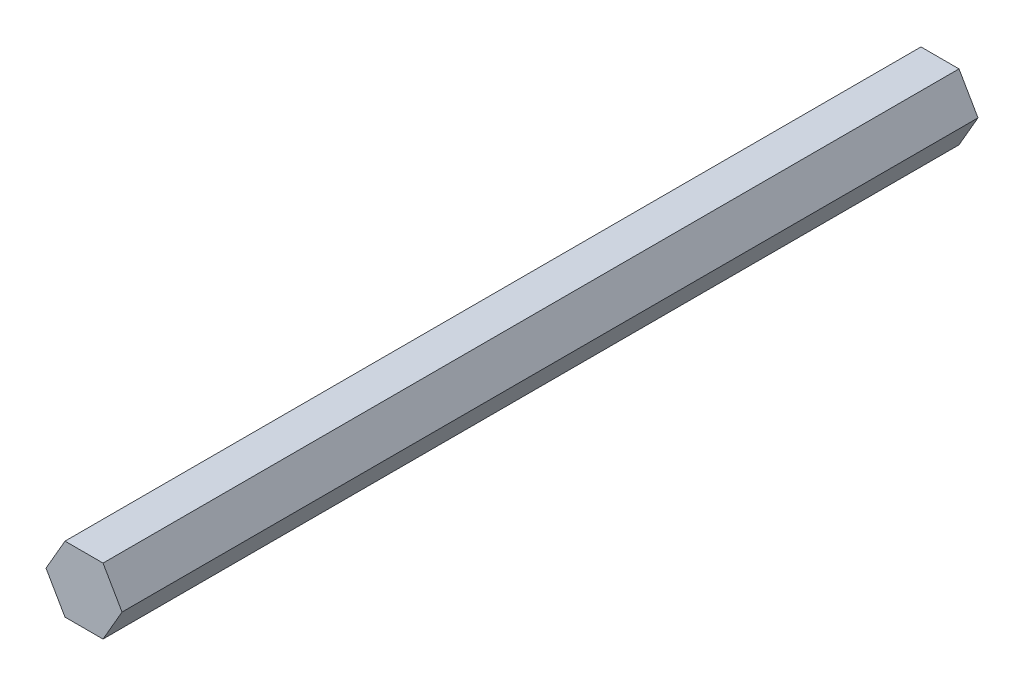
ISO-10303-21;
HEADER;
FILE_DESCRIPTION(('STEP AP214'),'2;1');
FILE_NAME('part.step','',(''),(''),'','','');
FILE_SCHEMA(('AUTOMOTIVE_DESIGN { 1 0 10303 214 1 1 1 1 }'));
ENDSEC;
DATA;
#1=APPLICATION_CONTEXT('core data for automotive mechanical design processes');
#2=APPLICATION_PROTOCOL_DEFINITION('international standard','automotive_design',2000,#1);
#3=PRODUCT_CONTEXT('',#1,'mechanical');
#4=PRODUCT('Part','Part','',(#3));
#5=PRODUCT_RELATED_PRODUCT_CATEGORY('part','',(#4));
#6=PRODUCT_DEFINITION_FORMATION('','',#4);
#7=PRODUCT_DEFINITION_CONTEXT('part definition',#1,'design');
#8=PRODUCT_DEFINITION('design','',#6,#7);
#9=PRODUCT_DEFINITION_SHAPE('','',#8);
#10=(LENGTH_UNIT() NAMED_UNIT(*) SI_UNIT(.MILLI.,.METRE.));
#11=(NAMED_UNIT(*) PLANE_ANGLE_UNIT() SI_UNIT($,.RADIAN.));
#12=(NAMED_UNIT(*) SI_UNIT($,.STERADIAN.) SOLID_ANGLE_UNIT());
#13=UNCERTAINTY_MEASURE_WITH_UNIT(LENGTH_MEASURE(1.E-05),#10,'distance_accuracy_value','');
#14=(GEOMETRIC_REPRESENTATION_CONTEXT(3) GLOBAL_UNCERTAINTY_ASSIGNED_CONTEXT((#13)) GLOBAL_UNIT_ASSIGNED_CONTEXT((#10,
#11,#12)) REPRESENTATION_CONTEXT('',''));
#15=CARTESIAN_POINT('',(0.,0.,0.));
#16=DIRECTION('',(0.,0.,1.));
#17=DIRECTION('',(1.,0.,0.));
#18=AXIS2_PLACEMENT_3D('',#15,#16,#17);
#19=CARTESIAN_POINT('',(-3.66879836416926,-6.34848422037909,165.1));
#20=DIRECTION('',(0.000413302037869118,0.999999914590709,0.));
#21=DIRECTION('',(-0.999999914590709,0.000413302037869118,0.));
#22=AXIS2_PLACEMENT_3D('',#19,#20,#21);
#23=PLANE('',#22);
#24=DIRECTION('',(0.999999914590709,-0.000413302037869118,0.));
#25=VECTOR('',#24,1.);
#26=CARTESIAN_POINT('',(-3.66879836416926,-6.34848422037909,0.));
#27=LINE('',#26,#25);
#28=CARTESIAN_POINT('',(-3.66879836416926,-6.34848422037909,0.));
#29=VERTEX_POINT('',#28);
#30=CARTESIAN_POINT('',(3.66354942828831,-6.35151469492291,0.));
#31=VERTEX_POINT('',#30);
#32=EDGE_CURVE('E120',#29,#31,#27,.T.);
#33=ORIENTED_EDGE('',*,*,#32,.T.);
#34=DIRECTION('',(0.,0.,-1.));
#35=VECTOR('',#34,1.);
#36=CARTESIAN_POINT('',(3.66354942828831,-6.35151469492291,165.1));
#37=LINE('',#36,#35);
#38=CARTESIAN_POINT('',(3.66354942828831,-6.35151469492291,165.1));
#39=VERTEX_POINT('',#38);
#40=EDGE_CURVE('E11',#39,#31,#37,.T.);
#41=ORIENTED_EDGE('',*,*,#40,.F.);
#42=DIRECTION('',(0.999999914590709,-0.000413302037869118,0.));
#43=VECTOR('',#42,1.);
#44=CARTESIAN_POINT('',(-3.66879836416926,-6.34848422037909,165.1));
#45=LINE('',#44,#43);
#46=CARTESIAN_POINT('',(-3.66879836416926,-6.34848422037909,165.1));
#47=VERTEX_POINT('',#46);
#48=EDGE_CURVE('E130',#47,#39,#45,.T.);
#49=ORIENTED_EDGE('',*,*,#48,.F.);
#50=DIRECTION('',(0.,0.,-1.));
#51=VECTOR('',#50,1.);
#52=CARTESIAN_POINT('',(-3.66879836416926,-6.34848422037909,165.1));
#53=LINE('',#52,#51);
#54=EDGE_CURVE('E116',#47,#29,#53,.T.);
#55=ORIENTED_EDGE('',*,*,#54,.T.);
#56=EDGE_LOOP('',(#33,#41,#49,#55));
#57=FACE_BOUND('',#56,.T.);
#58=ADVANCED_FACE('F36',(#57),#23,.F.);
#59=CARTESIAN_POINT('',(3.66354942828831,-6.35151469492291,165.1));
#60=DIRECTION('',(-0.865818678798889,0.500357887359585,0.));
#61=DIRECTION('',(-0.500357887359585,-0.865818678798889,0.));
#62=AXIS2_PLACEMENT_3D('',#59,#60,#61);
#63=PLANE('',#62);
#64=DIRECTION('',(0.500357887359585,0.865818678798889,0.));
#65=VECTOR('',#64,1.);
#66=CARTESIAN_POINT('',(3.66354942828831,-6.35151469492291,0.));
#67=LINE('',#66,#65);
#68=CARTESIAN_POINT('',(7.33234779245756,-0.0030304745438168,0.));
#69=VERTEX_POINT('',#68);
#70=EDGE_CURVE('E123',#31,#69,#67,.T.);
#71=ORIENTED_EDGE('',*,*,#70,.T.);
#72=DIRECTION('',(0.,0.,-1.));
#73=VECTOR('',#72,1.);
#74=CARTESIAN_POINT('',(7.33234779245756,-0.0030304745438168,165.1));
#75=LINE('',#74,#73);
#76=CARTESIAN_POINT('',(7.33234779245756,-0.0030304745438168,165.1));
#77=VERTEX_POINT('',#76);
#78=EDGE_CURVE('E44',#77,#69,#75,.T.);
#79=ORIENTED_EDGE('',*,*,#78,.F.);
#80=DIRECTION('',(0.500357887359585,0.865818678798889,0.));
#81=VECTOR('',#80,1.);
#82=CARTESIAN_POINT('',(3.66354942828831,-6.35151469492291,165.1));
#83=LINE('',#82,#81);
#84=EDGE_CURVE('E89',#39,#77,#83,.T.);
#85=ORIENTED_EDGE('',*,*,#84,.F.);
#86=ORIENTED_EDGE('',*,*,#40,.T.);
#87=EDGE_LOOP('',(#71,#79,#85,#86));
#88=FACE_BOUND('',#87,.T.);
#89=ADVANCED_FACE('F154',(#88),#63,.F.);
#90=CARTESIAN_POINT('',(7.33234779245756,-0.0030304745438168,165.1));
#91=DIRECTION('',(-0.866231980836757,-0.499642027231124,0.));
#92=DIRECTION('',(0.499642027231124,-0.866231980836758,0.));
#93=AXIS2_PLACEMENT_3D('',#90,#91,#92);
#94=PLANE('',#93);
#95=DIRECTION('',(-0.499642027231124,0.866231980836757,0.));
#96=VECTOR('',#95,1.);
#97=CARTESIAN_POINT('',(7.33234779245756,-0.0030304745438168,0.));
#98=LINE('',#97,#96);
#99=CARTESIAN_POINT('',(3.66879836416925,6.34848422037909,0.));
#100=VERTEX_POINT('',#99);
#101=EDGE_CURVE('E125',#69,#100,#98,.T.);
#102=ORIENTED_EDGE('',*,*,#101,.T.);
#103=DIRECTION('',(0.,0.,-1.));
#104=VECTOR('',#103,1.);
#105=CARTESIAN_POINT('',(3.66879836416925,6.34848422037909,165.1));
#106=LINE('',#105,#104);
#107=CARTESIAN_POINT('',(3.66879836416925,6.34848422037909,165.1));
#108=VERTEX_POINT('',#107);
#109=EDGE_CURVE('E111',#108,#100,#106,.T.);
#110=ORIENTED_EDGE('',*,*,#109,.F.);
#111=DIRECTION('',(-0.499642027231124,0.866231980836757,0.));
#112=VECTOR('',#111,1.);
#113=CARTESIAN_POINT('',(7.33234779245756,-0.0030304745438168,165.1));
#114=LINE('',#113,#112);
#115=EDGE_CURVE('E102',#77,#108,#114,.T.);
#116=ORIENTED_EDGE('',*,*,#115,.F.);
#117=ORIENTED_EDGE('',*,*,#78,.T.);
#118=EDGE_LOOP('',(#102,#110,#116,#117));
#119=FACE_BOUND('',#118,.T.);
#120=ADVANCED_FACE('F136',(#119),#94,.F.);
#121=CARTESIAN_POINT('',(3.66879836416925,6.34848422037909,165.1));
#122=DIRECTION('',(-0.000413302037869,-0.999999914590709,0.));
#123=DIRECTION('',(0.999999914590709,-0.000413302037869,0.));
#124=AXIS2_PLACEMENT_3D('',#121,#122,#123);
#125=PLANE('',#124);
#126=DIRECTION('',(-0.999999914590709,0.000413302037869,0.));
#127=VECTOR('',#126,1.);
#128=CARTESIAN_POINT('',(3.66879836416925,6.34848422037909,0.));
#129=LINE('',#128,#127);
#130=CARTESIAN_POINT('',(-3.66354942828832,6.35151469492291,0.));
#131=VERTEX_POINT('',#130);
#132=EDGE_CURVE('E110',#100,#131,#129,.T.);
#133=ORIENTED_EDGE('',*,*,#132,.T.);
#134=DIRECTION('',(0.,0.,-1.));
#135=VECTOR('',#134,1.);
#136=CARTESIAN_POINT('',(-3.66354942828832,6.35151469492291,165.1));
#137=LINE('',#136,#135);
#138=CARTESIAN_POINT('',(-3.66354942828832,6.35151469492291,165.1));
#139=VERTEX_POINT('',#138);
#140=EDGE_CURVE('E107',#139,#131,#137,.T.);
#141=ORIENTED_EDGE('',*,*,#140,.F.);
#142=DIRECTION('',(-0.999999914590709,0.000413302037869,0.));
#143=VECTOR('',#142,1.);
#144=CARTESIAN_POINT('',(3.66879836416925,6.34848422037909,165.1));
#145=LINE('',#144,#143);
#146=EDGE_CURVE('E96',#108,#139,#145,.T.);
#147=ORIENTED_EDGE('',*,*,#146,.F.);
#148=ORIENTED_EDGE('',*,*,#109,.T.);
#149=EDGE_LOOP('',(#133,#141,#147,#148));
#150=FACE_BOUND('',#149,.T.);
#151=ADVANCED_FACE('F108',(#150),#125,.F.);
#152=CARTESIAN_POINT('',(-3.66354942828832,6.35151469492291,165.1));
#153=DIRECTION('',(0.865818678798888,-0.500357887359585,0.));
#154=DIRECTION('',(0.500357887359585,0.865818678798889,0.));
#155=AXIS2_PLACEMENT_3D('',#152,#153,#154);
#156=PLANE('',#155);
#157=DIRECTION('',(-0.500357887359585,-0.865818678798888,0.));
#158=VECTOR('',#157,1.);
#159=CARTESIAN_POINT('',(-3.66354942828832,6.35151469492291,0.));
#160=LINE('',#159,#158);
#161=CARTESIAN_POINT('',(-7.33234779245757,0.0030304745438159,0.));
#162=VERTEX_POINT('',#161);
#163=EDGE_CURVE('E75',#131,#162,#160,.T.);
#164=ORIENTED_EDGE('',*,*,#163,.T.);
#165=DIRECTION('',(0.,0.,-1.));
#166=VECTOR('',#165,1.);
#167=CARTESIAN_POINT('',(-7.33234779245757,0.0030304745438159,165.1));
#168=LINE('',#167,#166);
#169=CARTESIAN_POINT('',(-7.33234779245757,0.0030304745438159,165.1));
#170=VERTEX_POINT('',#169);
#171=EDGE_CURVE('E112',#170,#162,#168,.T.);
#172=ORIENTED_EDGE('',*,*,#171,.F.);
#173=DIRECTION('',(-0.500357887359585,-0.865818678798888,0.));
#174=VECTOR('',#173,1.);
#175=CARTESIAN_POINT('',(-3.66354942828832,6.35151469492291,165.1));
#176=LINE('',#175,#174);
#177=EDGE_CURVE('E100',#139,#170,#176,.T.);
#178=ORIENTED_EDGE('',*,*,#177,.F.);
#179=ORIENTED_EDGE('',*,*,#140,.T.);
#180=EDGE_LOOP('',(#164,#172,#178,#179));
#181=FACE_BOUND('',#180,.T.);
#182=ADVANCED_FACE('F114',(#181),#156,.F.);
#183=CARTESIAN_POINT('',(-7.33234779245757,0.0030304745438159,165.1));
#184=DIRECTION('',(0.866231980836758,0.499642027231124,0.));
#185=DIRECTION('',(-0.499642027231124,0.866231980836758,0.));
#186=AXIS2_PLACEMENT_3D('',#183,#184,#185);
#187=PLANE('',#186);
#188=DIRECTION('',(0.499642027231124,-0.866231980836758,0.));
#189=VECTOR('',#188,1.);
#190=CARTESIAN_POINT('',(-7.33234779245757,0.0030304745438159,0.));
#191=LINE('',#190,#189);
#192=EDGE_CURVE('E81',#162,#29,#191,.T.);
#193=ORIENTED_EDGE('',*,*,#192,.T.);
#194=ORIENTED_EDGE('',*,*,#54,.F.);
#195=DIRECTION('',(0.499642027231124,-0.866231980836758,0.));
#196=VECTOR('',#195,1.);
#197=CARTESIAN_POINT('',(-7.33234779245757,0.0030304745438159,165.1));
#198=LINE('',#197,#196);
#199=EDGE_CURVE('E52',#170,#47,#198,.T.);
#200=ORIENTED_EDGE('',*,*,#199,.F.);
#201=ORIENTED_EDGE('',*,*,#171,.T.);
#202=EDGE_LOOP('',(#193,#194,#200,#201));
#203=FACE_BOUND('',#202,.T.);
#204=ADVANCED_FACE('F143',(#203),#187,.F.);
#205=CARTESIAN_POINT('',(0.,0.,165.1));
#206=DIRECTION('',(0.,0.,1.));
#207=DIRECTION('',(1.,0.,0.));
#208=AXIS2_PLACEMENT_3D('',#205,#206,#207);
#209=PLANE('',#208);
#210=ORIENTED_EDGE('',*,*,#48,.T.);
#211=ORIENTED_EDGE('',*,*,#84,.T.);
#212=ORIENTED_EDGE('',*,*,#115,.T.);
#213=ORIENTED_EDGE('',*,*,#146,.T.);
#214=ORIENTED_EDGE('',*,*,#177,.T.);
#215=ORIENTED_EDGE('',*,*,#199,.T.);
#216=EDGE_LOOP('',(#210,#211,#212,#213,#214,#215));
#217=FACE_BOUND('',#216,.T.);
#218=ADVANCED_FACE('F98',(#217),#209,.T.);
#219=CARTESIAN_POINT('',(0.,0.,0.));
#220=DIRECTION('',(0.,0.,1.));
#221=DIRECTION('',(1.,0.,0.));
#222=AXIS2_PLACEMENT_3D('',#219,#220,#221);
#223=PLANE('',#222);
#224=ORIENTED_EDGE('',*,*,#32,.F.);
#225=ORIENTED_EDGE('',*,*,#192,.F.);
#226=ORIENTED_EDGE('',*,*,#163,.F.);
#227=ORIENTED_EDGE('',*,*,#132,.F.);
#228=ORIENTED_EDGE('',*,*,#101,.F.);
#229=ORIENTED_EDGE('',*,*,#70,.F.);
#230=EDGE_LOOP('',(#224,#225,#226,#227,#228,#229));
#231=FACE_BOUND('',#230,.T.);
#232=ADVANCED_FACE('F139',(#231),#223,.F.);
#233=CLOSED_SHELL('',(#58,#89,#120,#151,#182,#204,#218,#232));
#234=MANIFOLD_SOLID_BREP('B2',#233);
#235=ADVANCED_BREP_SHAPE_REPRESENTATION('',(#18,#234),#14);
#236=SHAPE_DEFINITION_REPRESENTATION(#9,#235);
ENDSEC;
END-ISO-10303-21;
